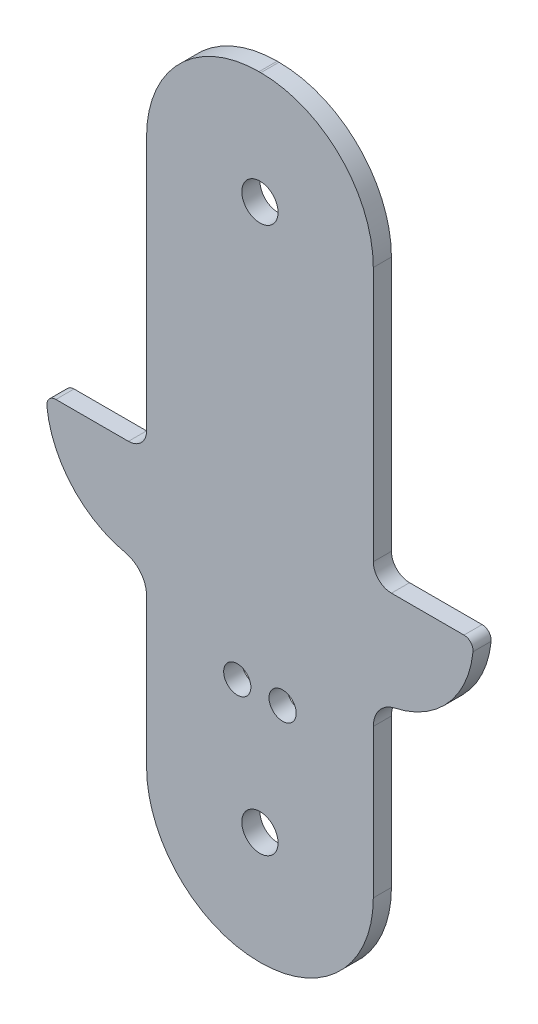
ISO-10303-21;
HEADER;
FILE_DESCRIPTION(('STEP AP214'),'2;1');
FILE_NAME('part.step','',(''),(''),'','','');
FILE_SCHEMA(('AUTOMOTIVE_DESIGN { 1 0 10303 214 1 1 1 1 }'));
ENDSEC;
DATA;
#1=APPLICATION_CONTEXT('core data for automotive mechanical design processes');
#2=APPLICATION_PROTOCOL_DEFINITION('international standard','automotive_design',2000,#1);
#3=PRODUCT_CONTEXT('',#1,'mechanical');
#4=PRODUCT('Part','Part','',(#3));
#5=PRODUCT_RELATED_PRODUCT_CATEGORY('part','',(#4));
#6=PRODUCT_DEFINITION_FORMATION('','',#4);
#7=PRODUCT_DEFINITION_CONTEXT('part definition',#1,'design');
#8=PRODUCT_DEFINITION('design','',#6,#7);
#9=PRODUCT_DEFINITION_SHAPE('','',#8);
#10=(LENGTH_UNIT() NAMED_UNIT(*) SI_UNIT(.MILLI.,.METRE.));
#11=(NAMED_UNIT(*) PLANE_ANGLE_UNIT() SI_UNIT($,.RADIAN.));
#12=(NAMED_UNIT(*) SI_UNIT($,.STERADIAN.) SOLID_ANGLE_UNIT());
#13=UNCERTAINTY_MEASURE_WITH_UNIT(LENGTH_MEASURE(1.E-05),#10,'distance_accuracy_value','');
#14=(GEOMETRIC_REPRESENTATION_CONTEXT(3) GLOBAL_UNCERTAINTY_ASSIGNED_CONTEXT((#13)) GLOBAL_UNIT_ASSIGNED_CONTEXT((#10,
#11,#12)) REPRESENTATION_CONTEXT('',''));
#15=CARTESIAN_POINT('',(0.,0.,0.));
#16=DIRECTION('',(0.,0.,1.));
#17=DIRECTION('',(1.,0.,0.));
#18=AXIS2_PLACEMENT_3D('',#15,#16,#17);
#19=CARTESIAN_POINT('',(-10.,41.5,2.));
#20=DIRECTION('',(0.,0.,1.));
#21=DIRECTION('',(1.,0.,0.));
#22=AXIS2_PLACEMENT_3D('',#19,#20,#21);
#23=PLANE('',#22);
#24=CARTESIAN_POINT('',(10.,25.7671838259057,2.));
#25=DIRECTION('',(0.,0.,1.));
#26=DIRECTION('',(1.,0.,0.));
#27=AXIS2_PLACEMENT_3D('',#24,#25,#26);
#28=CIRCLE('',#27,1.5);
#29=CARTESIAN_POINT('',(11.5,25.7671838259057,2.));
#30=VERTEX_POINT('',#29);
#31=EDGE_CURVE('E394',#30,#30,#28,.T.);
#32=ORIENTED_EDGE('',*,*,#31,.F.);
#33=EDGE_LOOP('',(#32));
#34=FACE_BOUND('',#33,.T.);
#35=CARTESIAN_POINT('',(12.5,72.6,2.));
#36=DIRECTION('',(0.,0.,1.));
#37=DIRECTION('',(1.,0.,0.));
#38=AXIS2_PLACEMENT_3D('',#35,#36,#37);
#39=CIRCLE('',#38,2.);
#40=CARTESIAN_POINT('',(14.5,72.6,2.));
#41=VERTEX_POINT('',#40);
#42=EDGE_CURVE('E204',#41,#41,#39,.T.);
#43=ORIENTED_EDGE('',*,*,#42,.F.);
#44=EDGE_LOOP('',(#43));
#45=FACE_BOUND('',#44,.T.);
#46=CARTESIAN_POINT('',(-10.,41.5,2.));
#47=DIRECTION('',(0.,0.,1.));
#48=DIRECTION('',(1.,0.,0.));
#49=AXIS2_PLACEMENT_3D('',#46,#47,#48);
#50=CIRCLE('',#49,0.999999999999994);
#51=CARTESIAN_POINT('',(-10.,42.5,2.));
#52=VERTEX_POINT('',#51);
#53=CARTESIAN_POINT('',(-10.99503719021,41.400496280979,2.));
#54=VERTEX_POINT('',#53);
#55=EDGE_CURVE('E239',#52,#54,#50,.T.);
#56=ORIENTED_EDGE('',*,*,#55,.T.);
#57=CARTESIAN_POINT('',(0.,42.5,2.));
#58=DIRECTION('',(0.,0.,1.));
#59=DIRECTION('',(1.,0.,0.));
#60=AXIS2_PLACEMENT_3D('',#57,#58,#59);
#61=CIRCLE('',#60,11.0498756211209);
#62=CARTESIAN_POINT('',(-2.35942493423425,31.7049610828883,2.));
#63=VERTEX_POINT('',#62);
#64=EDGE_CURVE('E127',#54,#63,#61,.T.);
#65=ORIENTED_EDGE('',*,*,#64,.T.);
#66=CARTESIAN_POINT('',(-3.,28.7741482971377,2.));
#67=DIRECTION('',(0.,0.,-1.));
#68=DIRECTION('',(-1.,0.,0.));
#69=AXIS2_PLACEMENT_3D('',#66,#67,#68);
#70=CIRCLE('',#69,3.);
#71=CARTESIAN_POINT('',(0.,28.7741482971377,2.));
#72=VERTEX_POINT('',#71);
#73=EDGE_CURVE('E290',#63,#72,#70,.T.);
#74=ORIENTED_EDGE('',*,*,#73,.T.);
#75=DIRECTION('',(0.,-1.,0.));
#76=VECTOR('',#75,1.);
#77=CARTESIAN_POINT('',(0.,12.4000000000001,2.));
#78=LINE('',#77,#76);
#79=CARTESIAN_POINT('',(0.,12.4000000000001,2.));
#80=VERTEX_POINT('',#79);
#81=EDGE_CURVE('E309',#72,#80,#78,.T.);
#82=ORIENTED_EDGE('',*,*,#81,.T.);
#83=CARTESIAN_POINT('',(12.4,12.4,2.));
#84=DIRECTION('',(0.,0.,1.));
#85=DIRECTION('',(-1.,0.,0.));
#86=AXIS2_PLACEMENT_3D('',#83,#84,#85);
#87=CIRCLE('',#86,12.4);
#88=CARTESIAN_POINT('',(12.4000000000001,0.,2.));
#89=VERTEX_POINT('',#88);
#90=EDGE_CURVE('E306',#80,#89,#87,.T.);
#91=ORIENTED_EDGE('',*,*,#90,.T.);
#92=DIRECTION('',(1.,0.,0.));
#93=VECTOR('',#92,1.);
#94=CARTESIAN_POINT('',(12.4000000000001,0.,2.));
#95=LINE('',#94,#93);
#96=CARTESIAN_POINT('',(12.5999999999999,0.,2.));
#97=VERTEX_POINT('',#96);
#98=EDGE_CURVE('E308',#89,#97,#95,.T.);
#99=ORIENTED_EDGE('',*,*,#98,.T.);
#100=CARTESIAN_POINT('',(12.6,12.4,2.));
#101=DIRECTION('',(0.,0.,1.));
#102=DIRECTION('',(1.,0.,0.));
#103=AXIS2_PLACEMENT_3D('',#100,#101,#102);
#104=CIRCLE('',#103,12.4);
#105=CARTESIAN_POINT('',(25.,12.4000000000001,2.));
#106=VERTEX_POINT('',#105);
#107=EDGE_CURVE('E311',#97,#106,#104,.T.);
#108=ORIENTED_EDGE('',*,*,#107,.T.);
#109=DIRECTION('',(0.,1.,0.));
#110=VECTOR('',#109,1.);
#111=CARTESIAN_POINT('',(25.,12.4000000000001,2.));
#112=LINE('',#111,#110);
#113=CARTESIAN_POINT('',(25.,28.7741482971377,2.));
#114=VERTEX_POINT('',#113);
#115=EDGE_CURVE('E317',#106,#114,#112,.T.);
#116=ORIENTED_EDGE('',*,*,#115,.T.);
#117=CARTESIAN_POINT('',(28.,28.7741482971377,2.));
#118=DIRECTION('',(0.,0.,-1.));
#119=DIRECTION('',(1.,0.,0.));
#120=AXIS2_PLACEMENT_3D('',#117,#118,#119);
#121=CIRCLE('',#120,3.);
#122=CARTESIAN_POINT('',(27.3594249342343,31.7049610828883,2.));
#123=VERTEX_POINT('',#122);
#124=EDGE_CURVE('E319',#114,#123,#121,.T.);
#125=ORIENTED_EDGE('',*,*,#124,.T.);
#126=CARTESIAN_POINT('',(25.,42.5,2.));
#127=DIRECTION('',(0.,0.,1.));
#128=DIRECTION('',(-1.,0.,0.));
#129=AXIS2_PLACEMENT_3D('',#126,#127,#128);
#130=CIRCLE('',#129,11.0498756211209);
#131=CARTESIAN_POINT('',(35.99503719021,41.400496280979,2.));
#132=VERTEX_POINT('',#131);
#133=EDGE_CURVE('E321',#123,#132,#130,.T.);
#134=ORIENTED_EDGE('',*,*,#133,.T.);
#135=CARTESIAN_POINT('',(35.,41.5,2.));
#136=DIRECTION('',(0.,0.,1.));
#137=DIRECTION('',(-1.,0.,0.));
#138=AXIS2_PLACEMENT_3D('',#135,#136,#137);
#139=CIRCLE('',#138,0.999999999999994);
#140=CARTESIAN_POINT('',(35.,42.5,2.));
#141=VERTEX_POINT('',#140);
#142=EDGE_CURVE('E323',#132,#141,#139,.T.);
#143=ORIENTED_EDGE('',*,*,#142,.T.);
#144=DIRECTION('',(-1.,0.,0.));
#145=VECTOR('',#144,1.);
#146=CARTESIAN_POINT('',(27.,42.5,2.));
#147=LINE('',#146,#145);
#148=CARTESIAN_POINT('',(27.,42.5,2.));
#149=VERTEX_POINT('',#148);
#150=EDGE_CURVE('E325',#141,#149,#147,.T.);
#151=ORIENTED_EDGE('',*,*,#150,.T.);
#152=CARTESIAN_POINT('',(27.,44.5,2.));
#153=DIRECTION('',(0.,0.,-1.));
#154=DIRECTION('',(-1.,0.,0.));
#155=AXIS2_PLACEMENT_3D('',#152,#153,#154);
#156=CIRCLE('',#155,2.00000000000001);
#157=CARTESIAN_POINT('',(25.,44.5,2.));
#158=VERTEX_POINT('',#157);
#159=EDGE_CURVE('E327',#149,#158,#156,.T.);
#160=ORIENTED_EDGE('',*,*,#159,.T.);
#161=DIRECTION('',(0.,1.,0.));
#162=VECTOR('',#161,1.);
#163=CARTESIAN_POINT('',(25.,44.5,2.));
#164=LINE('',#163,#162);
#165=CARTESIAN_POINT('',(25.,72.6,2.));
#166=VERTEX_POINT('',#165);
#167=EDGE_CURVE('E329',#158,#166,#164,.T.);
#168=ORIENTED_EDGE('',*,*,#167,.T.);
#169=CARTESIAN_POINT('',(12.6,72.6,2.));
#170=DIRECTION('',(0.,0.,1.));
#171=DIRECTION('',(-1.,0.,0.));
#172=AXIS2_PLACEMENT_3D('',#169,#170,#171);
#173=CIRCLE('',#172,12.4);
#174=CARTESIAN_POINT('',(12.6,85.,2.));
#175=VERTEX_POINT('',#174);
#176=EDGE_CURVE('E331',#166,#175,#173,.T.);
#177=ORIENTED_EDGE('',*,*,#176,.T.);
#178=DIRECTION('',(-1.,0.,0.));
#179=VECTOR('',#178,1.);
#180=CARTESIAN_POINT('',(12.4,85.,2.));
#181=LINE('',#180,#179);
#182=CARTESIAN_POINT('',(12.4,85.,2.));
#183=VERTEX_POINT('',#182);
#184=EDGE_CURVE('E333',#175,#183,#181,.T.);
#185=ORIENTED_EDGE('',*,*,#184,.T.);
#186=CARTESIAN_POINT('',(12.4,72.6,2.));
#187=DIRECTION('',(0.,0.,1.));
#188=DIRECTION('',(-1.,0.,0.));
#189=AXIS2_PLACEMENT_3D('',#186,#187,#188);
#190=CIRCLE('',#189,12.4);
#191=CARTESIAN_POINT('',(0.,72.6,2.));
#192=VERTEX_POINT('',#191);
#193=EDGE_CURVE('E182',#183,#192,#190,.T.);
#194=ORIENTED_EDGE('',*,*,#193,.T.);
#195=DIRECTION('',(0.,-1.,0.));
#196=VECTOR('',#195,1.);
#197=CARTESIAN_POINT('',(0.,44.5,2.));
#198=LINE('',#197,#196);
#199=CARTESIAN_POINT('',(0.,44.5,2.));
#200=VERTEX_POINT('',#199);
#201=EDGE_CURVE('E176',#192,#200,#198,.T.);
#202=ORIENTED_EDGE('',*,*,#201,.T.);
#203=CARTESIAN_POINT('',(-2.,44.5,2.));
#204=DIRECTION('',(0.,0.,-1.));
#205=DIRECTION('',(1.,0.,0.));
#206=AXIS2_PLACEMENT_3D('',#203,#204,#205);
#207=CIRCLE('',#206,2.00000000000001);
#208=CARTESIAN_POINT('',(-2.,42.5,2.));
#209=VERTEX_POINT('',#208);
#210=EDGE_CURVE('E180',#200,#209,#207,.T.);
#211=ORIENTED_EDGE('',*,*,#210,.T.);
#212=DIRECTION('',(-1.,0.,0.));
#213=VECTOR('',#212,1.);
#214=CARTESIAN_POINT('',(-2.,42.5,2.));
#215=LINE('',#214,#213);
#216=EDGE_CURVE('E48',#209,#52,#215,.T.);
#217=ORIENTED_EDGE('',*,*,#216,.T.);
#218=EDGE_LOOP('',(#56,#65,#74,#82,#91,#99,#108,#116,#125,#134,#143,#151,#160,#168,#177,#185,
#194,#202,#211,#217));
#219=FACE_BOUND('',#218,.T.);
#220=CARTESIAN_POINT('',(12.5,12.4,2.));
#221=DIRECTION('',(0.,0.,1.));
#222=DIRECTION('',(1.,0.,0.));
#223=AXIS2_PLACEMENT_3D('',#220,#221,#222);
#224=CIRCLE('',#223,2.);
#225=CARTESIAN_POINT('',(14.5,12.4,2.));
#226=VERTEX_POINT('',#225);
#227=EDGE_CURVE('E400',#226,#226,#224,.T.);
#228=ORIENTED_EDGE('',*,*,#227,.F.);
#229=EDGE_LOOP('',(#228));
#230=FACE_BOUND('',#229,.T.);
#231=CARTESIAN_POINT('',(15.,25.7671838259057,2.));
#232=DIRECTION('',(0.,0.,1.));
#233=DIRECTION('',(1.,0.,0.));
#234=AXIS2_PLACEMENT_3D('',#231,#232,#233);
#235=CIRCLE('',#234,1.5);
#236=CARTESIAN_POINT('',(16.5,25.7671838259057,2.));
#237=VERTEX_POINT('',#236);
#238=EDGE_CURVE('E385',#237,#237,#235,.T.);
#239=ORIENTED_EDGE('',*,*,#238,.F.);
#240=EDGE_LOOP('',(#239));
#241=FACE_BOUND('',#240,.T.);
#242=ADVANCED_FACE('F31',(#34,#45,#219,#230,#241),#23,.T.);
#243=CARTESIAN_POINT('',(-10.,41.5,0.));
#244=DIRECTION('',(0.,0.,1.));
#245=DIRECTION('',(1.,0.,0.));
#246=AXIS2_PLACEMENT_3D('',#243,#244,#245);
#247=PLANE('',#246);
#248=CARTESIAN_POINT('',(10.,25.7671838259057,0.));
#249=DIRECTION('',(0.,0.,1.));
#250=DIRECTION('',(1.,0.,0.));
#251=AXIS2_PLACEMENT_3D('',#248,#249,#250);
#252=CIRCLE('',#251,1.5);
#253=CARTESIAN_POINT('',(11.5,25.7671838259057,0.));
#254=VERTEX_POINT('',#253);
#255=EDGE_CURVE('E391',#254,#254,#252,.T.);
#256=ORIENTED_EDGE('',*,*,#255,.T.);
#257=EDGE_LOOP('',(#256));
#258=FACE_BOUND('',#257,.T.);
#259=CARTESIAN_POINT('',(12.5,72.6,0.));
#260=DIRECTION('',(0.,0.,1.));
#261=DIRECTION('',(1.,0.,0.));
#262=AXIS2_PLACEMENT_3D('',#259,#260,#261);
#263=CIRCLE('',#262,2.);
#264=CARTESIAN_POINT('',(14.5,72.6,0.));
#265=VERTEX_POINT('',#264);
#266=EDGE_CURVE('E403',#265,#265,#263,.T.);
#267=ORIENTED_EDGE('',*,*,#266,.T.);
#268=EDGE_LOOP('',(#267));
#269=FACE_BOUND('',#268,.T.);
#270=CARTESIAN_POINT('',(-10.,41.5,0.));
#271=DIRECTION('',(0.,0.,1.));
#272=DIRECTION('',(1.,0.,0.));
#273=AXIS2_PLACEMENT_3D('',#270,#271,#272);
#274=CIRCLE('',#273,0.999999999999994);
#275=CARTESIAN_POINT('',(-10.,42.5,0.));
#276=VERTEX_POINT('',#275);
#277=CARTESIAN_POINT('',(-10.99503719021,41.400496280979,0.));
#278=VERTEX_POINT('',#277);
#279=EDGE_CURVE('E200',#276,#278,#274,.T.);
#280=ORIENTED_EDGE('',*,*,#279,.F.);
#281=DIRECTION('',(-1.,0.,0.));
#282=VECTOR('',#281,1.);
#283=CARTESIAN_POINT('',(-2.,42.5,0.));
#284=LINE('',#283,#282);
#285=CARTESIAN_POINT('',(-2.,42.5,0.));
#286=VERTEX_POINT('',#285);
#287=EDGE_CURVE('E119',#286,#276,#284,.T.);
#288=ORIENTED_EDGE('',*,*,#287,.F.);
#289=CARTESIAN_POINT('',(-2.,44.5,0.));
#290=DIRECTION('',(0.,0.,-1.));
#291=DIRECTION('',(1.,0.,0.));
#292=AXIS2_PLACEMENT_3D('',#289,#290,#291);
#293=CIRCLE('',#292,2.00000000000001);
#294=CARTESIAN_POINT('',(0.,44.5,0.));
#295=VERTEX_POINT('',#294);
#296=EDGE_CURVE('E113',#295,#286,#293,.T.);
#297=ORIENTED_EDGE('',*,*,#296,.F.);
#298=DIRECTION('',(0.,-1.,0.));
#299=VECTOR('',#298,1.);
#300=CARTESIAN_POINT('',(0.,44.5,0.));
#301=LINE('',#300,#299);
#302=CARTESIAN_POINT('',(0.,72.6,0.));
#303=VERTEX_POINT('',#302);
#304=EDGE_CURVE('E190',#303,#295,#301,.T.);
#305=ORIENTED_EDGE('',*,*,#304,.F.);
#306=CARTESIAN_POINT('',(12.4,72.6,0.));
#307=DIRECTION('',(0.,0.,1.));
#308=DIRECTION('',(-1.,0.,0.));
#309=AXIS2_PLACEMENT_3D('',#306,#307,#308);
#310=CIRCLE('',#309,12.4);
#311=CARTESIAN_POINT('',(12.4,85.,0.));
#312=VERTEX_POINT('',#311);
#313=EDGE_CURVE('E234',#312,#303,#310,.T.);
#314=ORIENTED_EDGE('',*,*,#313,.F.);
#315=DIRECTION('',(-1.,0.,0.));
#316=VECTOR('',#315,1.);
#317=CARTESIAN_POINT('',(12.4,85.,0.));
#318=LINE('',#317,#316);
#319=CARTESIAN_POINT('',(12.6,85.,0.));
#320=VERTEX_POINT('',#319);
#321=EDGE_CURVE('E232',#320,#312,#318,.T.);
#322=ORIENTED_EDGE('',*,*,#321,.F.);
#323=CARTESIAN_POINT('',(12.6,72.6,0.));
#324=DIRECTION('',(0.,0.,1.));
#325=DIRECTION('',(-1.,0.,0.));
#326=AXIS2_PLACEMENT_3D('',#323,#324,#325);
#327=CIRCLE('',#326,12.4);
#328=CARTESIAN_POINT('',(25.,72.6,0.));
#329=VERTEX_POINT('',#328);
#330=EDGE_CURVE('E230',#329,#320,#327,.T.);
#331=ORIENTED_EDGE('',*,*,#330,.F.);
#332=DIRECTION('',(0.,1.,0.));
#333=VECTOR('',#332,1.);
#334=CARTESIAN_POINT('',(25.,44.5,0.));
#335=LINE('',#334,#333);
#336=CARTESIAN_POINT('',(25.,44.5,0.));
#337=VERTEX_POINT('',#336);
#338=EDGE_CURVE('E228',#337,#329,#335,.T.);
#339=ORIENTED_EDGE('',*,*,#338,.F.);
#340=CARTESIAN_POINT('',(27.,44.5,0.));
#341=DIRECTION('',(0.,0.,-1.));
#342=DIRECTION('',(-1.,0.,0.));
#343=AXIS2_PLACEMENT_3D('',#340,#341,#342);
#344=CIRCLE('',#343,2.00000000000001);
#345=CARTESIAN_POINT('',(27.,42.5,0.));
#346=VERTEX_POINT('',#345);
#347=EDGE_CURVE('E226',#346,#337,#344,.T.);
#348=ORIENTED_EDGE('',*,*,#347,.F.);
#349=DIRECTION('',(-1.,0.,0.));
#350=VECTOR('',#349,1.);
#351=CARTESIAN_POINT('',(27.,42.5,0.));
#352=LINE('',#351,#350);
#353=CARTESIAN_POINT('',(35.,42.5,0.));
#354=VERTEX_POINT('',#353);
#355=EDGE_CURVE('E224',#354,#346,#352,.T.);
#356=ORIENTED_EDGE('',*,*,#355,.F.);
#357=CARTESIAN_POINT('',(35.,41.5,0.));
#358=DIRECTION('',(0.,0.,1.));
#359=DIRECTION('',(-1.,0.,0.));
#360=AXIS2_PLACEMENT_3D('',#357,#358,#359);
#361=CIRCLE('',#360,0.999999999999994);
#362=CARTESIAN_POINT('',(35.99503719021,41.400496280979,0.));
#363=VERTEX_POINT('',#362);
#364=EDGE_CURVE('E222',#363,#354,#361,.T.);
#365=ORIENTED_EDGE('',*,*,#364,.F.);
#366=CARTESIAN_POINT('',(25.,42.5,0.));
#367=DIRECTION('',(0.,0.,1.));
#368=DIRECTION('',(-1.,0.,0.));
#369=AXIS2_PLACEMENT_3D('',#366,#367,#368);
#370=CIRCLE('',#369,11.0498756211209);
#371=CARTESIAN_POINT('',(27.3594249342343,31.7049610828883,0.));
#372=VERTEX_POINT('',#371);
#373=EDGE_CURVE('E220',#372,#363,#370,.T.);
#374=ORIENTED_EDGE('',*,*,#373,.F.);
#375=CARTESIAN_POINT('',(28.,28.7741482971377,0.));
#376=DIRECTION('',(0.,0.,-1.));
#377=DIRECTION('',(1.,0.,0.));
#378=AXIS2_PLACEMENT_3D('',#375,#376,#377);
#379=CIRCLE('',#378,3.);
#380=CARTESIAN_POINT('',(25.,28.7741482971377,0.));
#381=VERTEX_POINT('',#380);
#382=EDGE_CURVE('E218',#381,#372,#379,.T.);
#383=ORIENTED_EDGE('',*,*,#382,.F.);
#384=DIRECTION('',(0.,1.,0.));
#385=VECTOR('',#384,1.);
#386=CARTESIAN_POINT('',(25.,12.4000000000001,0.));
#387=LINE('',#386,#385);
#388=CARTESIAN_POINT('',(25.,12.4000000000001,0.));
#389=VERTEX_POINT('',#388);
#390=EDGE_CURVE('E216',#389,#381,#387,.T.);
#391=ORIENTED_EDGE('',*,*,#390,.F.);
#392=CARTESIAN_POINT('',(12.6,12.4,0.));
#393=DIRECTION('',(0.,0.,1.));
#394=DIRECTION('',(1.,0.,0.));
#395=AXIS2_PLACEMENT_3D('',#392,#393,#394);
#396=CIRCLE('',#395,12.4);
#397=CARTESIAN_POINT('',(12.5999999999999,0.,0.));
#398=VERTEX_POINT('',#397);
#399=EDGE_CURVE('E214',#398,#389,#396,.T.);
#400=ORIENTED_EDGE('',*,*,#399,.F.);
#401=DIRECTION('',(1.,0.,0.));
#402=VECTOR('',#401,1.);
#403=CARTESIAN_POINT('',(12.4000000000001,0.,0.));
#404=LINE('',#403,#402);
#405=CARTESIAN_POINT('',(12.4000000000001,0.,0.));
#406=VERTEX_POINT('',#405);
#407=EDGE_CURVE('E212',#406,#398,#404,.T.);
#408=ORIENTED_EDGE('',*,*,#407,.F.);
#409=CARTESIAN_POINT('',(12.4,12.4,0.));
#410=DIRECTION('',(0.,0.,1.));
#411=DIRECTION('',(-1.,0.,0.));
#412=AXIS2_PLACEMENT_3D('',#409,#410,#411);
#413=CIRCLE('',#412,12.4);
#414=CARTESIAN_POINT('',(0.,12.4000000000001,0.));
#415=VERTEX_POINT('',#414);
#416=EDGE_CURVE('E210',#415,#406,#413,.T.);
#417=ORIENTED_EDGE('',*,*,#416,.F.);
#418=DIRECTION('',(0.,-1.,0.));
#419=VECTOR('',#418,1.);
#420=CARTESIAN_POINT('',(0.,12.4000000000001,0.));
#421=LINE('',#420,#419);
#422=CARTESIAN_POINT('',(0.,28.7741482971377,0.));
#423=VERTEX_POINT('',#422);
#424=EDGE_CURVE('E208',#423,#415,#421,.T.);
#425=ORIENTED_EDGE('',*,*,#424,.F.);
#426=CARTESIAN_POINT('',(-3.,28.7741482971377,0.));
#427=DIRECTION('',(0.,0.,-1.));
#428=DIRECTION('',(-1.,0.,0.));
#429=AXIS2_PLACEMENT_3D('',#426,#427,#428);
#430=CIRCLE('',#429,3.);
#431=CARTESIAN_POINT('',(-2.35942493423425,31.7049610828883,0.));
#432=VERTEX_POINT('',#431);
#433=EDGE_CURVE('E206',#432,#423,#430,.T.);
#434=ORIENTED_EDGE('',*,*,#433,.F.);
#435=CARTESIAN_POINT('',(0.,42.5,0.));
#436=DIRECTION('',(0.,0.,1.));
#437=DIRECTION('',(1.,0.,0.));
#438=AXIS2_PLACEMENT_3D('',#435,#436,#437);
#439=CIRCLE('',#438,11.0498756211209);
#440=EDGE_CURVE('E203',#278,#432,#439,.T.);
#441=ORIENTED_EDGE('',*,*,#440,.F.);
#442=EDGE_LOOP('',(#280,#288,#297,#305,#314,#322,#331,#339,#348,#356,#365,#374,#383,#391,#400,
#408,#417,#425,#434,#441));
#443=FACE_BOUND('',#442,.T.);
#444=CARTESIAN_POINT('',(12.5,12.4,0.));
#445=DIRECTION('',(0.,0.,1.));
#446=DIRECTION('',(1.,0.,0.));
#447=AXIS2_PLACEMENT_3D('',#444,#445,#446);
#448=CIRCLE('',#447,2.);
#449=CARTESIAN_POINT('',(14.5,12.4,0.));
#450=VERTEX_POINT('',#449);
#451=EDGE_CURVE('E397',#450,#450,#448,.T.);
#452=ORIENTED_EDGE('',*,*,#451,.T.);
#453=EDGE_LOOP('',(#452));
#454=FACE_BOUND('',#453,.T.);
#455=CARTESIAN_POINT('',(15.,25.7671838259057,0.));
#456=DIRECTION('',(0.,0.,1.));
#457=DIRECTION('',(1.,0.,0.));
#458=AXIS2_PLACEMENT_3D('',#455,#456,#457);
#459=CIRCLE('',#458,1.5);
#460=CARTESIAN_POINT('',(16.5,25.7671838259057,0.));
#461=VERTEX_POINT('',#460);
#462=EDGE_CURVE('E388',#461,#461,#459,.T.);
#463=ORIENTED_EDGE('',*,*,#462,.T.);
#464=EDGE_LOOP('',(#463));
#465=FACE_BOUND('',#464,.T.);
#466=ADVANCED_FACE('F294',(#258,#269,#443,#454,#465),#247,.F.);
#467=CARTESIAN_POINT('',(-10.,41.5,2.));
#468=DIRECTION('',(0.,0.,-1.));
#469=DIRECTION('',(-1.,0.,0.));
#470=AXIS2_PLACEMENT_3D('',#467,#468,#469);
#471=CYLINDRICAL_SURFACE('',#470,0.999999999999994);
#472=ORIENTED_EDGE('',*,*,#279,.T.);
#473=DIRECTION('',(0.,0.,-1.));
#474=VECTOR('',#473,1.);
#475=CARTESIAN_POINT('',(-10.99503719021,41.400496280979,2.));
#476=LINE('',#475,#474);
#477=EDGE_CURVE('E11',#54,#278,#476,.T.);
#478=ORIENTED_EDGE('',*,*,#477,.F.);
#479=ORIENTED_EDGE('',*,*,#55,.F.);
#480=DIRECTION('',(0.,0.,-1.));
#481=VECTOR('',#480,1.);
#482=CARTESIAN_POINT('',(-10.,42.5,2.));
#483=LINE('',#482,#481);
#484=EDGE_CURVE('E196',#52,#276,#483,.T.);
#485=ORIENTED_EDGE('',*,*,#484,.T.);
#486=EDGE_LOOP('',(#472,#478,#479,#485));
#487=FACE_BOUND('',#486,.T.);
#488=ADVANCED_FACE('F33',(#487),#471,.T.);
#489=CARTESIAN_POINT('',(0.,42.5,2.));
#490=DIRECTION('',(0.,0.,-1.));
#491=DIRECTION('',(-1.,0.,0.));
#492=AXIS2_PLACEMENT_3D('',#489,#490,#491);
#493=CYLINDRICAL_SURFACE('',#492,11.0498756211209);
#494=ORIENTED_EDGE('',*,*,#440,.T.);
#495=DIRECTION('',(0.,0.,-1.));
#496=VECTOR('',#495,1.);
#497=CARTESIAN_POINT('',(-2.35942493423425,31.7049610828883,2.));
#498=LINE('',#497,#496);
#499=EDGE_CURVE('E40',#63,#432,#498,.T.);
#500=ORIENTED_EDGE('',*,*,#499,.F.);
#501=ORIENTED_EDGE('',*,*,#64,.F.);
#502=ORIENTED_EDGE('',*,*,#477,.T.);
#503=EDGE_LOOP('',(#494,#500,#501,#502));
#504=FACE_BOUND('',#503,.T.);
#505=ADVANCED_FACE('F592',(#504),#493,.T.);
#506=CARTESIAN_POINT('',(-3.,28.7741482971377,2.));
#507=DIRECTION('',(0.,0.,-1.));
#508=DIRECTION('',(-1.,0.,0.));
#509=AXIS2_PLACEMENT_3D('',#506,#507,#508);
#510=CYLINDRICAL_SURFACE('',#509,3.);
#511=ORIENTED_EDGE('',*,*,#433,.T.);
#512=DIRECTION('',(0.,0.,-1.));
#513=VECTOR('',#512,1.);
#514=CARTESIAN_POINT('',(0.,28.7741482971377,2.));
#515=LINE('',#514,#513);
#516=EDGE_CURVE('E282',#72,#423,#515,.T.);
#517=ORIENTED_EDGE('',*,*,#516,.F.);
#518=ORIENTED_EDGE('',*,*,#73,.F.);
#519=ORIENTED_EDGE('',*,*,#499,.T.);
#520=EDGE_LOOP('',(#511,#517,#518,#519));
#521=FACE_BOUND('',#520,.T.);
#522=ADVANCED_FACE('F288',(#521),#510,.F.);
#523=CARTESIAN_POINT('',(0.,12.4000000000001,2.));
#524=DIRECTION('',(1.,0.,0.));
#525=DIRECTION('',(0.,1.,0.));
#526=AXIS2_PLACEMENT_3D('',#523,#524,#525);
#527=PLANE('',#526);
#528=ORIENTED_EDGE('',*,*,#424,.T.);
#529=DIRECTION('',(0.,0.,-1.));
#530=VECTOR('',#529,1.);
#531=CARTESIAN_POINT('',(0.,12.4000000000001,2.));
#532=LINE('',#531,#530);
#533=EDGE_CURVE('E279',#80,#415,#532,.T.);
#534=ORIENTED_EDGE('',*,*,#533,.F.);
#535=ORIENTED_EDGE('',*,*,#81,.F.);
#536=ORIENTED_EDGE('',*,*,#516,.T.);
#537=EDGE_LOOP('',(#528,#534,#535,#536));
#538=FACE_BOUND('',#537,.T.);
#539=ADVANCED_FACE('F300',(#538),#527,.F.);
#540=CARTESIAN_POINT('',(12.4,12.4,2.));
#541=DIRECTION('',(0.,0.,-1.));
#542=DIRECTION('',(-1.,0.,0.));
#543=AXIS2_PLACEMENT_3D('',#540,#541,#542);
#544=CYLINDRICAL_SURFACE('',#543,12.4);
#545=ORIENTED_EDGE('',*,*,#416,.T.);
#546=DIRECTION('',(0.,0.,-1.));
#547=VECTOR('',#546,1.);
#548=CARTESIAN_POINT('',(12.4000000000001,0.,2.));
#549=LINE('',#548,#547);
#550=EDGE_CURVE('E276',#89,#406,#549,.T.);
#551=ORIENTED_EDGE('',*,*,#550,.F.);
#552=ORIENTED_EDGE('',*,*,#90,.F.);
#553=ORIENTED_EDGE('',*,*,#533,.T.);
#554=EDGE_LOOP('',(#545,#551,#552,#553));
#555=FACE_BOUND('',#554,.T.);
#556=ADVANCED_FACE('F304',(#555),#544,.T.);
#557=CARTESIAN_POINT('',(12.4000000000001,0.,2.));
#558=DIRECTION('',(0.,1.,0.));
#559=DIRECTION('',(0.,0.,1.));
#560=AXIS2_PLACEMENT_3D('',#557,#558,#559);
#561=PLANE('',#560);
#562=ORIENTED_EDGE('',*,*,#407,.T.);
#563=DIRECTION('',(0.,0.,-1.));
#564=VECTOR('',#563,1.);
#565=CARTESIAN_POINT('',(12.5999999999999,0.,2.));
#566=LINE('',#565,#564);
#567=EDGE_CURVE('E273',#97,#398,#566,.T.);
#568=ORIENTED_EDGE('',*,*,#567,.F.);
#569=ORIENTED_EDGE('',*,*,#98,.F.);
#570=ORIENTED_EDGE('',*,*,#550,.T.);
#571=EDGE_LOOP('',(#562,#568,#569,#570));
#572=FACE_BOUND('',#571,.T.);
#573=ADVANCED_FACE('F557',(#572),#561,.F.);
#574=CARTESIAN_POINT('',(12.6,12.4,2.));
#575=DIRECTION('',(0.,0.,-1.));
#576=DIRECTION('',(-1.,0.,0.));
#577=AXIS2_PLACEMENT_3D('',#574,#575,#576);
#578=CYLINDRICAL_SURFACE('',#577,12.4);
#579=ORIENTED_EDGE('',*,*,#399,.T.);
#580=DIRECTION('',(0.,0.,-1.));
#581=VECTOR('',#580,1.);
#582=CARTESIAN_POINT('',(25.,12.4000000000001,2.));
#583=LINE('',#582,#581);
#584=EDGE_CURVE('E270',#106,#389,#583,.T.);
#585=ORIENTED_EDGE('',*,*,#584,.F.);
#586=ORIENTED_EDGE('',*,*,#107,.F.);
#587=ORIENTED_EDGE('',*,*,#567,.T.);
#588=EDGE_LOOP('',(#579,#585,#586,#587));
#589=FACE_BOUND('',#588,.T.);
#590=ADVANCED_FACE('F547',(#589),#578,.T.);
#591=CARTESIAN_POINT('',(25.,12.4000000000001,2.));
#592=DIRECTION('',(-1.,0.,0.));
#593=DIRECTION('',(0.,0.,1.));
#594=AXIS2_PLACEMENT_3D('',#591,#592,#593);
#595=PLANE('',#594);
#596=ORIENTED_EDGE('',*,*,#390,.T.);
#597=DIRECTION('',(0.,0.,-1.));
#598=VECTOR('',#597,1.);
#599=CARTESIAN_POINT('',(25.,28.7741482971377,2.));
#600=LINE('',#599,#598);
#601=EDGE_CURVE('E267',#114,#381,#600,.T.);
#602=ORIENTED_EDGE('',*,*,#601,.F.);
#603=ORIENTED_EDGE('',*,*,#115,.F.);
#604=ORIENTED_EDGE('',*,*,#584,.T.);
#605=EDGE_LOOP('',(#596,#602,#603,#604));
#606=FACE_BOUND('',#605,.T.);
#607=ADVANCED_FACE('F537',(#606),#595,.F.);
#608=CARTESIAN_POINT('',(28.,28.7741482971377,2.));
#609=DIRECTION('',(0.,0.,-1.));
#610=DIRECTION('',(-1.,0.,0.));
#611=AXIS2_PLACEMENT_3D('',#608,#609,#610);
#612=CYLINDRICAL_SURFACE('',#611,3.);
#613=ORIENTED_EDGE('',*,*,#382,.T.);
#614=DIRECTION('',(0.,0.,-1.));
#615=VECTOR('',#614,1.);
#616=CARTESIAN_POINT('',(27.3594249342343,31.7049610828883,2.));
#617=LINE('',#616,#615);
#618=EDGE_CURVE('E264',#123,#372,#617,.T.);
#619=ORIENTED_EDGE('',*,*,#618,.F.);
#620=ORIENTED_EDGE('',*,*,#124,.F.);
#621=ORIENTED_EDGE('',*,*,#601,.T.);
#622=EDGE_LOOP('',(#613,#619,#620,#621));
#623=FACE_BOUND('',#622,.T.);
#624=ADVANCED_FACE('F527',(#623),#612,.F.);
#625=CARTESIAN_POINT('',(25.,42.5,2.));
#626=DIRECTION('',(0.,0.,-1.));
#627=DIRECTION('',(-1.,0.,0.));
#628=AXIS2_PLACEMENT_3D('',#625,#626,#627);
#629=CYLINDRICAL_SURFACE('',#628,11.0498756211209);
#630=ORIENTED_EDGE('',*,*,#373,.T.);
#631=DIRECTION('',(0.,0.,-1.));
#632=VECTOR('',#631,1.);
#633=CARTESIAN_POINT('',(35.99503719021,41.400496280979,2.));
#634=LINE('',#633,#632);
#635=EDGE_CURVE('E261',#132,#363,#634,.T.);
#636=ORIENTED_EDGE('',*,*,#635,.F.);
#637=ORIENTED_EDGE('',*,*,#133,.F.);
#638=ORIENTED_EDGE('',*,*,#618,.T.);
#639=EDGE_LOOP('',(#630,#636,#637,#638));
#640=FACE_BOUND('',#639,.T.);
#641=ADVANCED_FACE('F517',(#640),#629,.T.);
#642=CARTESIAN_POINT('',(35.,41.5,2.));
#643=DIRECTION('',(0.,0.,-1.));
#644=DIRECTION('',(-1.,0.,0.));
#645=AXIS2_PLACEMENT_3D('',#642,#643,#644);
#646=CYLINDRICAL_SURFACE('',#645,0.999999999999994);
#647=ORIENTED_EDGE('',*,*,#364,.T.);
#648=DIRECTION('',(0.,0.,-1.));
#649=VECTOR('',#648,1.);
#650=CARTESIAN_POINT('',(35.,42.5,2.));
#651=LINE('',#650,#649);
#652=EDGE_CURVE('E258',#141,#354,#651,.T.);
#653=ORIENTED_EDGE('',*,*,#652,.F.);
#654=ORIENTED_EDGE('',*,*,#142,.F.);
#655=ORIENTED_EDGE('',*,*,#635,.T.);
#656=EDGE_LOOP('',(#647,#653,#654,#655));
#657=FACE_BOUND('',#656,.T.);
#658=ADVANCED_FACE('F507',(#657),#646,.T.);
#659=CARTESIAN_POINT('',(27.,42.5,2.));
#660=DIRECTION('',(0.,-1.,0.));
#661=DIRECTION('',(0.,0.,-1.));
#662=AXIS2_PLACEMENT_3D('',#659,#660,#661);
#663=PLANE('',#662);
#664=ORIENTED_EDGE('',*,*,#355,.T.);
#665=DIRECTION('',(0.,0.,-1.));
#666=VECTOR('',#665,1.);
#667=CARTESIAN_POINT('',(27.,42.5,2.));
#668=LINE('',#667,#666);
#669=EDGE_CURVE('E255',#149,#346,#668,.T.);
#670=ORIENTED_EDGE('',*,*,#669,.F.);
#671=ORIENTED_EDGE('',*,*,#150,.F.);
#672=ORIENTED_EDGE('',*,*,#652,.T.);
#673=EDGE_LOOP('',(#664,#670,#671,#672));
#674=FACE_BOUND('',#673,.T.);
#675=ADVANCED_FACE('F497',(#674),#663,.F.);
#676=CARTESIAN_POINT('',(27.,44.5,2.));
#677=DIRECTION('',(0.,0.,-1.));
#678=DIRECTION('',(-1.,0.,0.));
#679=AXIS2_PLACEMENT_3D('',#676,#677,#678);
#680=CYLINDRICAL_SURFACE('',#679,2.00000000000001);
#681=ORIENTED_EDGE('',*,*,#347,.T.);
#682=DIRECTION('',(0.,0.,-1.));
#683=VECTOR('',#682,1.);
#684=CARTESIAN_POINT('',(25.,44.5,2.));
#685=LINE('',#684,#683);
#686=EDGE_CURVE('E252',#158,#337,#685,.T.);
#687=ORIENTED_EDGE('',*,*,#686,.F.);
#688=ORIENTED_EDGE('',*,*,#159,.F.);
#689=ORIENTED_EDGE('',*,*,#669,.T.);
#690=EDGE_LOOP('',(#681,#687,#688,#689));
#691=FACE_BOUND('',#690,.T.);
#692=ADVANCED_FACE('F487',(#691),#680,.F.);
#693=CARTESIAN_POINT('',(25.,44.5,2.));
#694=DIRECTION('',(-1.,0.,0.));
#695=DIRECTION('',(0.,0.,1.));
#696=AXIS2_PLACEMENT_3D('',#693,#694,#695);
#697=PLANE('',#696);
#698=ORIENTED_EDGE('',*,*,#338,.T.);
#699=DIRECTION('',(0.,0.,-1.));
#700=VECTOR('',#699,1.);
#701=CARTESIAN_POINT('',(25.,72.6,2.));
#702=LINE('',#701,#700);
#703=EDGE_CURVE('E249',#166,#329,#702,.T.);
#704=ORIENTED_EDGE('',*,*,#703,.F.);
#705=ORIENTED_EDGE('',*,*,#167,.F.);
#706=ORIENTED_EDGE('',*,*,#686,.T.);
#707=EDGE_LOOP('',(#698,#704,#705,#706));
#708=FACE_BOUND('',#707,.T.);
#709=ADVANCED_FACE('F477',(#708),#697,.F.);
#710=CARTESIAN_POINT('',(12.6,72.6,2.));
#711=DIRECTION('',(0.,0.,-1.));
#712=DIRECTION('',(-1.,0.,0.));
#713=AXIS2_PLACEMENT_3D('',#710,#711,#712);
#714=CYLINDRICAL_SURFACE('',#713,12.4);
#715=ORIENTED_EDGE('',*,*,#330,.T.);
#716=DIRECTION('',(0.,0.,-1.));
#717=VECTOR('',#716,1.);
#718=CARTESIAN_POINT('',(12.6,85.,2.));
#719=LINE('',#718,#717);
#720=EDGE_CURVE('E246',#175,#320,#719,.T.);
#721=ORIENTED_EDGE('',*,*,#720,.F.);
#722=ORIENTED_EDGE('',*,*,#176,.F.);
#723=ORIENTED_EDGE('',*,*,#703,.T.);
#724=EDGE_LOOP('',(#715,#721,#722,#723));
#725=FACE_BOUND('',#724,.T.);
#726=ADVANCED_FACE('F468',(#725),#714,.T.);
#727=CARTESIAN_POINT('',(12.4,85.,2.));
#728=DIRECTION('',(0.,-1.,0.));
#729=DIRECTION('',(0.,0.,-1.));
#730=AXIS2_PLACEMENT_3D('',#727,#728,#729);
#731=PLANE('',#730);
#732=ORIENTED_EDGE('',*,*,#321,.T.);
#733=DIRECTION('',(0.,0.,-1.));
#734=VECTOR('',#733,1.);
#735=CARTESIAN_POINT('',(12.4,85.,2.));
#736=LINE('',#735,#734);
#737=EDGE_CURVE('E243',#183,#312,#736,.T.);
#738=ORIENTED_EDGE('',*,*,#737,.F.);
#739=ORIENTED_EDGE('',*,*,#184,.F.);
#740=ORIENTED_EDGE('',*,*,#720,.T.);
#741=EDGE_LOOP('',(#732,#738,#739,#740));
#742=FACE_BOUND('',#741,.T.);
#743=ADVANCED_FACE('F339',(#742),#731,.F.);
#744=CARTESIAN_POINT('',(12.4,72.6,2.));
#745=DIRECTION('',(0.,0.,-1.));
#746=DIRECTION('',(-1.,0.,0.));
#747=AXIS2_PLACEMENT_3D('',#744,#745,#746);
#748=CYLINDRICAL_SURFACE('',#747,12.4);
#749=ORIENTED_EDGE('',*,*,#313,.T.);
#750=DIRECTION('',(0.,0.,-1.));
#751=VECTOR('',#750,1.);
#752=CARTESIAN_POINT('',(0.,72.6,2.));
#753=LINE('',#752,#751);
#754=EDGE_CURVE('E191',#192,#303,#753,.T.);
#755=ORIENTED_EDGE('',*,*,#754,.F.);
#756=ORIENTED_EDGE('',*,*,#193,.F.);
#757=ORIENTED_EDGE('',*,*,#737,.T.);
#758=EDGE_LOOP('',(#749,#755,#756,#757));
#759=FACE_BOUND('',#758,.T.);
#760=ADVANCED_FACE('F343',(#759),#748,.T.);
#761=CARTESIAN_POINT('',(0.,44.5,2.));
#762=DIRECTION('',(1.,0.,0.));
#763=DIRECTION('',(0.,0.,-1.));
#764=AXIS2_PLACEMENT_3D('',#761,#762,#763);
#765=PLANE('',#764);
#766=ORIENTED_EDGE('',*,*,#304,.T.);
#767=DIRECTION('',(0.,0.,-1.));
#768=VECTOR('',#767,1.);
#769=CARTESIAN_POINT('',(0.,44.5,2.));
#770=LINE('',#769,#768);
#771=EDGE_CURVE('E187',#200,#295,#770,.T.);
#772=ORIENTED_EDGE('',*,*,#771,.F.);
#773=ORIENTED_EDGE('',*,*,#201,.F.);
#774=ORIENTED_EDGE('',*,*,#754,.T.);
#775=EDGE_LOOP('',(#766,#772,#773,#774));
#776=FACE_BOUND('',#775,.T.);
#777=ADVANCED_FACE('F188',(#776),#765,.F.);
#778=CARTESIAN_POINT('',(-2.,44.5,2.));
#779=DIRECTION('',(0.,0.,-1.));
#780=DIRECTION('',(-1.,0.,0.));
#781=AXIS2_PLACEMENT_3D('',#778,#779,#780);
#782=CYLINDRICAL_SURFACE('',#781,2.00000000000001);
#783=ORIENTED_EDGE('',*,*,#296,.T.);
#784=DIRECTION('',(0.,0.,-1.));
#785=VECTOR('',#784,1.);
#786=CARTESIAN_POINT('',(-2.,42.5,2.));
#787=LINE('',#786,#785);
#788=EDGE_CURVE('E192',#209,#286,#787,.T.);
#789=ORIENTED_EDGE('',*,*,#788,.F.);
#790=ORIENTED_EDGE('',*,*,#210,.F.);
#791=ORIENTED_EDGE('',*,*,#771,.T.);
#792=EDGE_LOOP('',(#783,#789,#790,#791));
#793=FACE_BOUND('',#792,.T.);
#794=ADVANCED_FACE('F194',(#793),#782,.F.);
#795=CARTESIAN_POINT('',(-2.,42.5,2.));
#796=DIRECTION('',(0.,-1.,0.));
#797=DIRECTION('',(0.,0.,-1.));
#798=AXIS2_PLACEMENT_3D('',#795,#796,#797);
#799=PLANE('',#798);
#800=ORIENTED_EDGE('',*,*,#287,.T.);
#801=ORIENTED_EDGE('',*,*,#484,.F.);
#802=ORIENTED_EDGE('',*,*,#216,.F.);
#803=ORIENTED_EDGE('',*,*,#788,.T.);
#804=EDGE_LOOP('',(#800,#801,#802,#803));
#805=FACE_BOUND('',#804,.T.);
#806=ADVANCED_FACE('F347',(#805),#799,.F.);
#807=CARTESIAN_POINT('',(12.5,72.6,2.));
#808=DIRECTION('',(0.,0.,-1.));
#809=DIRECTION('',(-1.,0.,0.));
#810=AXIS2_PLACEMENT_3D('',#807,#808,#809);
#811=CYLINDRICAL_SURFACE('',#810,2.);
#812=ORIENTED_EDGE('',*,*,#42,.T.);
#813=EDGE_LOOP('',(#812));
#814=FACE_BOUND('',#813,.T.);
#815=ORIENTED_EDGE('',*,*,#266,.F.);
#816=EDGE_LOOP('',(#815));
#817=FACE_BOUND('',#816,.T.);
#818=ADVANCED_FACE('F349',(#814,#817),#811,.F.);
#819=CARTESIAN_POINT('',(12.5,12.4,2.));
#820=DIRECTION('',(0.,0.,-1.));
#821=DIRECTION('',(-1.,0.,0.));
#822=AXIS2_PLACEMENT_3D('',#819,#820,#821);
#823=CYLINDRICAL_SURFACE('',#822,2.);
#824=ORIENTED_EDGE('',*,*,#227,.T.);
#825=EDGE_LOOP('',(#824));
#826=FACE_BOUND('',#825,.T.);
#827=ORIENTED_EDGE('',*,*,#451,.F.);
#828=EDGE_LOOP('',(#827));
#829=FACE_BOUND('',#828,.T.);
#830=ADVANCED_FACE('F355',(#826,#829),#823,.F.);
#831=CARTESIAN_POINT('',(10.,25.7671838259057,2.));
#832=DIRECTION('',(0.,0.,-1.));
#833=DIRECTION('',(-1.,0.,0.));
#834=AXIS2_PLACEMENT_3D('',#831,#832,#833);
#835=CYLINDRICAL_SURFACE('',#834,1.5);
#836=ORIENTED_EDGE('',*,*,#31,.T.);
#837=EDGE_LOOP('',(#836));
#838=FACE_BOUND('',#837,.T.);
#839=ORIENTED_EDGE('',*,*,#255,.F.);
#840=EDGE_LOOP('',(#839));
#841=FACE_BOUND('',#840,.T.);
#842=ADVANCED_FACE('F372',(#838,#841),#835,.F.);
#843=CARTESIAN_POINT('',(15.,25.7671838259057,2.));
#844=DIRECTION('',(0.,0.,-1.));
#845=DIRECTION('',(-1.,0.,0.));
#846=AXIS2_PLACEMENT_3D('',#843,#844,#845);
#847=CYLINDRICAL_SURFACE('',#846,1.5);
#848=ORIENTED_EDGE('',*,*,#238,.T.);
#849=EDGE_LOOP('',(#848));
#850=FACE_BOUND('',#849,.T.);
#851=ORIENTED_EDGE('',*,*,#462,.F.);
#852=EDGE_LOOP('',(#851));
#853=FACE_BOUND('',#852,.T.);
#854=ADVANCED_FACE('F376',(#850,#853),#847,.F.);
#855=CLOSED_SHELL('',(#242,#466,#488,#505,#522,#539,#556,#573,#590,#607,#624,#641,#658,#675,
#692,#709,#726,#743,#760,#777,#794,#806,#818,#830,#842,#854));
#856=MANIFOLD_SOLID_BREP('B2',#855);
#857=ADVANCED_BREP_SHAPE_REPRESENTATION('',(#18,#856),#14);
#858=SHAPE_DEFINITION_REPRESENTATION(#9,#857);
ENDSEC;
END-ISO-10303-21;
